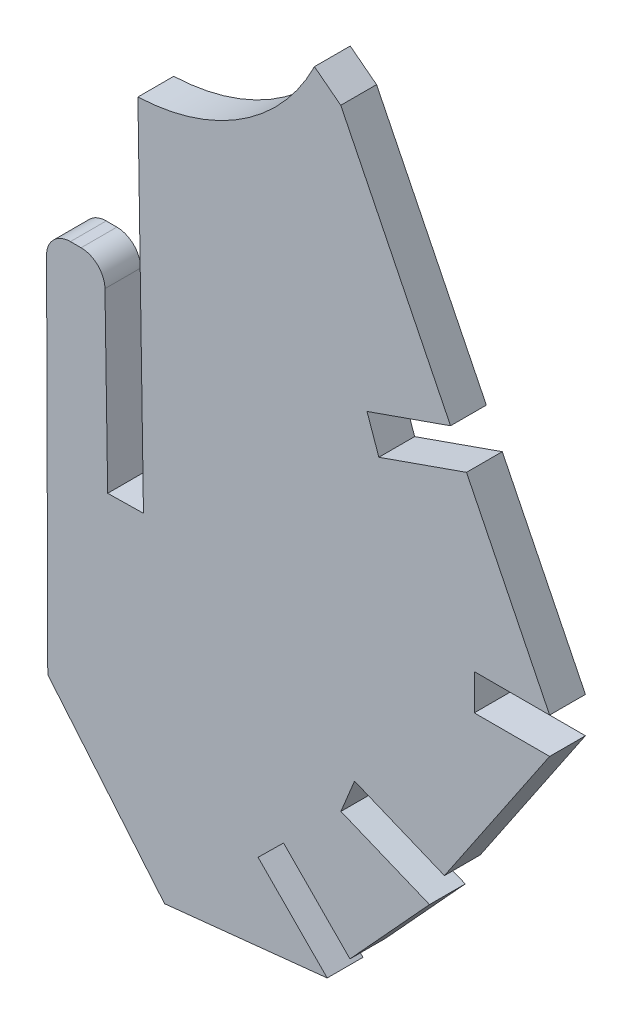
ISO-10303-21;
HEADER;
FILE_DESCRIPTION(('STEP AP214'),'2;1');
FILE_NAME('part.step','',(''),(''),'','','');
FILE_SCHEMA(('AUTOMOTIVE_DESIGN { 1 0 10303 214 1 1 1 1 }'));
ENDSEC;
DATA;
#1=APPLICATION_CONTEXT('core data for automotive mechanical design processes');
#2=APPLICATION_PROTOCOL_DEFINITION('international standard','automotive_design',2000,#1);
#3=PRODUCT_CONTEXT('',#1,'mechanical');
#4=PRODUCT('Part','Part','',(#3));
#5=PRODUCT_RELATED_PRODUCT_CATEGORY('part','',(#4));
#6=PRODUCT_DEFINITION_FORMATION('','',#4);
#7=PRODUCT_DEFINITION_CONTEXT('part definition',#1,'design');
#8=PRODUCT_DEFINITION('design','',#6,#7);
#9=PRODUCT_DEFINITION_SHAPE('','',#8);
#10=(LENGTH_UNIT() NAMED_UNIT(*) SI_UNIT(.MILLI.,.METRE.));
#11=(NAMED_UNIT(*) PLANE_ANGLE_UNIT() SI_UNIT($,.RADIAN.));
#12=(NAMED_UNIT(*) SI_UNIT($,.STERADIAN.) SOLID_ANGLE_UNIT());
#13=UNCERTAINTY_MEASURE_WITH_UNIT(LENGTH_MEASURE(1.E-05),#10,'distance_accuracy_value','');
#14=(GEOMETRIC_REPRESENTATION_CONTEXT(3) GLOBAL_UNCERTAINTY_ASSIGNED_CONTEXT((#13)) GLOBAL_UNIT_ASSIGNED_CONTEXT((#10,
#11,#12)) REPRESENTATION_CONTEXT('',''));
#15=CARTESIAN_POINT('',(0.,0.,0.));
#16=DIRECTION('',(0.,0.,1.));
#17=DIRECTION('',(1.,0.,0.));
#18=AXIS2_PLACEMENT_3D('',#15,#16,#17);
#19=CARTESIAN_POINT('',(1122.56231727025,109.439552642469,3.00000000000003));
#20=DIRECTION('',(0.,0.,-1.));
#21=DIRECTION('',(-1.,0.,0.));
#22=AXIS2_PLACEMENT_3D('',#19,#20,#21);
#23=CYLINDRICAL_SURFACE('',#22,17.2292656753027);
#24=CARTESIAN_POINT('',(1122.56231727025,109.439552642469,0.));
#25=DIRECTION('',(0.,0.,-1.));
#26=DIRECTION('',(1.,0.,0.));
#27=AXIS2_PLACEMENT_3D('',#24,#25,#26);
#28=CIRCLE('',#27,17.2292656753027);
#29=CARTESIAN_POINT('',(1138.01648220933,101.822704098241,2.0122792321331E-13));
#30=VERTEX_POINT('',#29);
#31=CARTESIAN_POINT('',(1123.21782403942,92.2227612286829,0.));
#32=VERTEX_POINT('',#31);
#33=EDGE_CURVE('E214',#30,#32,#28,.T.);
#34=ORIENTED_EDGE('',*,*,#33,.T.);
#35=DIRECTION('',(0.,0.,-1.));
#36=VECTOR('',#35,1.);
#37=CARTESIAN_POINT('',(1123.21782403942,92.222761228683,3.00000000000004));
#38=LINE('',#37,#36);
#39=CARTESIAN_POINT('',(1123.21782403942,92.222761228683,3.00000000000004));
#40=VERTEX_POINT('',#39);
#41=EDGE_CURVE('E11',#40,#32,#38,.T.);
#42=ORIENTED_EDGE('',*,*,#41,.F.);
#43=CARTESIAN_POINT('',(1122.56231727025,109.439552642469,3.00000000000003));
#44=DIRECTION('',(0.,0.,-1.));
#45=DIRECTION('',(1.,0.,0.));
#46=AXIS2_PLACEMENT_3D('',#43,#44,#45);
#47=CIRCLE('',#46,17.2292656753027);
#48=CARTESIAN_POINT('',(1138.01648220933,101.822704098241,3.00000000000021));
#49=VERTEX_POINT('',#48);
#50=EDGE_CURVE('E279',#49,#40,#47,.T.);
#51=ORIENTED_EDGE('',*,*,#50,.F.);
#52=DIRECTION('',(0.,0.,-1.));
#53=VECTOR('',#52,1.);
#54=CARTESIAN_POINT('',(1138.01648220933,101.822704098241,3.00000000000021));
#55=LINE('',#54,#53);
#56=EDGE_CURVE('E227',#49,#30,#55,.T.);
#57=ORIENTED_EDGE('',*,*,#56,.T.);
#58=EDGE_LOOP('',(#34,#42,#51,#57));
#59=FACE_BOUND('',#58,.T.);
#60=ADVANCED_FACE('F32',(#59),#23,.F.);
#61=CARTESIAN_POINT('',(1123.6820568135,62.2263533115428,3.00000000000001));
#62=DIRECTION('',(0.999880263904669,0.0154744258028453,0.));
#63=DIRECTION('',(-0.0154744258028454,0.999880263904671,0.));
#64=AXIS2_PLACEMENT_3D('',#61,#62,#63);
#65=PLANE('',#64);
#66=DIRECTION('',(0.0154744258028454,-0.999880263904671,0.));
#67=VECTOR('',#66,1.);
#68=CARTESIAN_POINT('',(1123.6820568135,62.2263533115428,0.));
#69=LINE('',#68,#67);
#70=CARTESIAN_POINT('',(1123.6820568135,62.2263533115428,0.));
#71=VERTEX_POINT('',#70);
#72=EDGE_CURVE('E210',#32,#71,#69,.T.);
#73=ORIENTED_EDGE('',*,*,#72,.T.);
#74=DIRECTION('',(0.,0.,-1.));
#75=VECTOR('',#74,1.);
#76=CARTESIAN_POINT('',(1123.6820568135,62.2263533115428,3.00000000000001));
#77=LINE('',#76,#75);
#78=CARTESIAN_POINT('',(1123.6820568135,62.2263533115428,3.00000000000001));
#79=VERTEX_POINT('',#78);
#80=EDGE_CURVE('E39',#79,#71,#77,.T.);
#81=ORIENTED_EDGE('',*,*,#80,.F.);
#82=DIRECTION('',(0.0154744258028454,-0.999880263904671,0.));
#83=VECTOR('',#82,1.);
#84=CARTESIAN_POINT('',(1123.6820568135,62.2263533115428,3.00000000000001));
#85=LINE('',#84,#83);
#86=EDGE_CURVE('E223',#40,#79,#85,.T.);
#87=ORIENTED_EDGE('',*,*,#86,.F.);
#88=ORIENTED_EDGE('',*,*,#41,.T.);
#89=EDGE_LOOP('',(#73,#81,#87,#88));
#90=FACE_BOUND('',#89,.T.);
#91=ADVANCED_FACE('F222',(#90),#65,.F.);
#92=CARTESIAN_POINT('',(1120.68241602179,62.1799300341342,3.00000000000025));
#93=DIRECTION('',(0.0154744258028453,-0.99988026390467,0.));
#94=DIRECTION('',(0.999880263904669,0.0154744258028453,0.));
#95=AXIS2_PLACEMENT_3D('',#92,#93,#94);
#96=PLANE('',#95);
#97=DIRECTION('',(-0.999880263904669,-0.0154744258028452,0.));
#98=VECTOR('',#97,1.);
#99=CARTESIAN_POINT('',(1120.68241602179,62.1799300341342,2.4980018054066E-13));
#100=LINE('',#99,#98);
#101=CARTESIAN_POINT('',(1120.68241602179,62.1799300341342,2.4980018054066E-13));
#102=VERTEX_POINT('',#101);
#103=EDGE_CURVE('E216',#71,#102,#100,.T.);
#104=ORIENTED_EDGE('',*,*,#103,.T.);
#105=DIRECTION('',(0.,0.,-1.));
#106=VECTOR('',#105,1.);
#107=CARTESIAN_POINT('',(1120.68241602179,62.1799300341342,3.00000000000025));
#108=LINE('',#107,#106);
#109=CARTESIAN_POINT('',(1120.68241602179,62.1799300341342,3.00000000000025));
#110=VERTEX_POINT('',#109);
#111=EDGE_CURVE('E400',#110,#102,#108,.T.);
#112=ORIENTED_EDGE('',*,*,#111,.F.);
#113=DIRECTION('',(-0.999880263904669,-0.0154744258028452,0.));
#114=VECTOR('',#113,1.);
#115=CARTESIAN_POINT('',(1120.68241602179,62.1799300341342,3.00000000000025));
#116=LINE('',#115,#114);
#117=EDGE_CURVE('E282',#79,#110,#116,.T.);
#118=ORIENTED_EDGE('',*,*,#117,.F.);
#119=ORIENTED_EDGE('',*,*,#80,.T.);
#120=EDGE_LOOP('',(#104,#112,#118,#119));
#121=FACE_BOUND('',#120,.T.);
#122=ADVANCED_FACE('F404',(#121),#96,.F.);
#123=CARTESIAN_POINT('',(1120.68241602179,62.1799300341342,3.00000000000025));
#124=DIRECTION('',(-0.999880263904737,-0.0154744257984556,0.));
#125=DIRECTION('',(0.0154744257984557,-0.999880263904739,0.));
#126=AXIS2_PLACEMENT_3D('',#123,#124,#125);
#127=PLANE('',#126);
#128=DIRECTION('',(-0.0154744257984556,0.999880263904739,0.));
#129=VECTOR('',#128,1.);
#130=CARTESIAN_POINT('',(1120.68241602179,62.1799300341342,2.4980018054066E-13));
#131=LINE('',#130,#129);
#132=CARTESIAN_POINT('',(1120.45422071051,76.924773625341,0.));
#133=VERTEX_POINT('',#132);
#134=EDGE_CURVE('E231',#102,#133,#131,.T.);
#135=ORIENTED_EDGE('',*,*,#134,.T.);
#136=DIRECTION('',(0.,0.,-1.));
#137=VECTOR('',#136,1.);
#138=CARTESIAN_POINT('',(1120.45422071051,76.9247736253409,3.00000000000013));
#139=LINE('',#138,#137);
#140=CARTESIAN_POINT('',(1120.45422071051,76.9247736253409,3.00000000000013));
#141=VERTEX_POINT('',#140);
#142=EDGE_CURVE('E397',#141,#133,#139,.T.);
#143=ORIENTED_EDGE('',*,*,#142,.F.);
#144=DIRECTION('',(-0.0154744257984556,0.999880263904739,0.));
#145=VECTOR('',#144,1.);
#146=CARTESIAN_POINT('',(1120.68241602179,62.1799300341342,3.00000000000025));
#147=LINE('',#146,#145);
#148=EDGE_CURVE('E284',#110,#141,#147,.T.);
#149=ORIENTED_EDGE('',*,*,#148,.F.);
#150=ORIENTED_EDGE('',*,*,#111,.T.);
#151=EDGE_LOOP('',(#135,#143,#149,#150));
#152=FACE_BOUND('',#151,.T.);
#153=ADVANCED_FACE('F412',(#152),#127,.F.);
#154=CARTESIAN_POINT('',(1118.4544601827,76.8938247737439,3.0000000000002));
#155=DIRECTION('',(0.,0.,-1.));
#156=DIRECTION('',(-1.,0.,0.));
#157=AXIS2_PLACEMENT_3D('',#154,#155,#156);
#158=CYLINDRICAL_SURFACE('',#157,1.9999999999975);
#159=CARTESIAN_POINT('',(1118.4544601827,76.893824773744,0.));
#160=DIRECTION('',(0.,0.,1.));
#161=DIRECTION('',(1.,0.,0.));
#162=AXIS2_PLACEMENT_3D('',#159,#160,#161);
#163=CIRCLE('',#162,1.9999999999975);
#164=CARTESIAN_POINT('',(1118.4544601827,78.8938247737414,1.6306400674182E-13));
#165=VERTEX_POINT('',#164);
#166=EDGE_CURVE('E233',#133,#165,#163,.T.);
#167=ORIENTED_EDGE('',*,*,#166,.T.);
#168=DIRECTION('',(0.,0.,-1.));
#169=VECTOR('',#168,1.);
#170=CARTESIAN_POINT('',(1118.4544601827,78.8938247737414,3.00000000000011));
#171=LINE('',#170,#169);
#172=CARTESIAN_POINT('',(1118.4544601827,78.8938247737414,3.00000000000011));
#173=VERTEX_POINT('',#172);
#174=EDGE_CURVE('E394',#173,#165,#171,.T.);
#175=ORIENTED_EDGE('',*,*,#174,.F.);
#176=CARTESIAN_POINT('',(1118.4544601827,76.8938247737439,3.0000000000002));
#177=DIRECTION('',(0.,0.,1.));
#178=DIRECTION('',(1.,0.,0.));
#179=AXIS2_PLACEMENT_3D('',#176,#177,#178);
#180=CIRCLE('',#179,1.9999999999975);
#181=EDGE_CURVE('E286',#141,#173,#180,.T.);
#182=ORIENTED_EDGE('',*,*,#181,.F.);
#183=ORIENTED_EDGE('',*,*,#142,.T.);
#184=EDGE_LOOP('',(#167,#175,#182,#183));
#185=FACE_BOUND('',#184,.T.);
#186=ADVANCED_FACE('F415',(#185),#158,.T.);
#187=CARTESIAN_POINT('',(1118.4544601827,78.8938247737413,3.00000000000013));
#188=DIRECTION('',(0.,-1.,0.));
#189=DIRECTION('',(1.,0.,0.));
#190=AXIS2_PLACEMENT_3D('',#187,#188,#189);
#191=PLANE('',#190);
#192=DIRECTION('',(-1.,0.,0.));
#193=VECTOR('',#192,1.);
#194=CARTESIAN_POINT('',(1118.4544601827,78.8938247737413,1.43982048506075E-13));
#195=LINE('',#194,#193);
#196=CARTESIAN_POINT('',(1117.55919909577,78.8938247737414,1.76941794549634E-13));
#197=VERTEX_POINT('',#196);
#198=EDGE_CURVE('E235',#165,#197,#195,.T.);
#199=ORIENTED_EDGE('',*,*,#198,.T.);
#200=DIRECTION('',(0.,0.,-1.));
#201=VECTOR('',#200,1.);
#202=CARTESIAN_POINT('',(1117.55919909577,78.8938247737414,3.00000000000018));
#203=LINE('',#202,#201);
#204=CARTESIAN_POINT('',(1117.55919909577,78.8938247737414,3.00000000000018));
#205=VERTEX_POINT('',#204);
#206=EDGE_CURVE('E391',#205,#197,#203,.T.);
#207=ORIENTED_EDGE('',*,*,#206,.F.);
#208=DIRECTION('',(-1.,0.,0.));
#209=VECTOR('',#208,1.);
#210=CARTESIAN_POINT('',(1118.4544601827,78.8938247737413,3.00000000000013));
#211=LINE('',#210,#209);
#212=EDGE_CURVE('E288',#173,#205,#211,.T.);
#213=ORIENTED_EDGE('',*,*,#212,.F.);
#214=ORIENTED_EDGE('',*,*,#174,.T.);
#215=EDGE_LOOP('',(#199,#207,#213,#214));
#216=FACE_BOUND('',#215,.T.);
#217=ADVANCED_FACE('F420',(#216),#191,.F.);
#218=CARTESIAN_POINT('',(1117.55919909577,76.8938247737439,3.00000000000022));
#219=DIRECTION('',(0.,0.,-1.));
#220=DIRECTION('',(-1.,0.,0.));
#221=AXIS2_PLACEMENT_3D('',#218,#219,#220);
#222=CYLINDRICAL_SURFACE('',#221,1.99999999999705);
#223=CARTESIAN_POINT('',(1117.55919909577,76.893824773744,0.));
#224=DIRECTION('',(0.,0.,1.));
#225=DIRECTION('',(-1.,0.,0.));
#226=AXIS2_PLACEMENT_3D('',#223,#224,#225);
#227=CIRCLE('',#226,1.99999999999705);
#228=CARTESIAN_POINT('',(1115.55921001566,76.8872157318644,1.49186218934005E-13));
#229=VERTEX_POINT('',#228);
#230=EDGE_CURVE('E237',#197,#229,#227,.T.);
#231=ORIENTED_EDGE('',*,*,#230,.T.);
#232=DIRECTION('',(0.,0.,-1.));
#233=VECTOR('',#232,1.);
#234=CARTESIAN_POINT('',(1115.55921001566,76.8872157318644,3.00000000000016));
#235=LINE('',#234,#233);
#236=CARTESIAN_POINT('',(1115.55921001566,76.8872157318644,3.00000000000016));
#237=VERTEX_POINT('',#236);
#238=EDGE_CURVE('E388',#237,#229,#235,.T.);
#239=ORIENTED_EDGE('',*,*,#238,.F.);
#240=CARTESIAN_POINT('',(1117.55919909577,76.8938247737439,3.00000000000022));
#241=DIRECTION('',(0.,0.,1.));
#242=DIRECTION('',(-1.,0.,0.));
#243=AXIS2_PLACEMENT_3D('',#240,#241,#242);
#244=CIRCLE('',#243,1.99999999999705);
#245=EDGE_CURVE('E290',#205,#237,#244,.T.);
#246=ORIENTED_EDGE('',*,*,#245,.F.);
#247=ORIENTED_EDGE('',*,*,#206,.T.);
#248=EDGE_LOOP('',(#231,#239,#246,#247));
#249=FACE_BOUND('',#248,.T.);
#250=ADVANCED_FACE('F426',(#249),#222,.T.);
#251=CARTESIAN_POINT('',(1115.65962808626,46.4992944116065,3.00000000000013));
#252=DIRECTION('',(0.999994540055773,0.00330452093979811,0.));
#253=DIRECTION('',(-0.00330452093979833,0.999994540055775,0.));
#254=AXIS2_PLACEMENT_3D('',#251,#252,#253);
#255=PLANE('',#254);
#256=DIRECTION('',(0.00330452093979833,-0.999994540055774,0.));
#257=VECTOR('',#256,1.);
#258=CARTESIAN_POINT('',(1115.65962808626,46.4992944116065,1.75207071073658E-13));
#259=LINE('',#258,#257);
#260=CARTESIAN_POINT('',(1115.65962808626,46.4992944116065,1.75207071073658E-13));
#261=VERTEX_POINT('',#260);
#262=EDGE_CURVE('E239',#229,#261,#259,.T.);
#263=ORIENTED_EDGE('',*,*,#262,.T.);
#264=DIRECTION('',(0.,0.,-1.));
#265=VECTOR('',#264,1.);
#266=CARTESIAN_POINT('',(1115.65962808626,46.4992944116065,3.00000000000013));
#267=LINE('',#266,#265);
#268=CARTESIAN_POINT('',(1115.65962808626,46.4992944116065,3.00000000000013));
#269=VERTEX_POINT('',#268);
#270=EDGE_CURVE('E385',#269,#261,#267,.T.);
#271=ORIENTED_EDGE('',*,*,#270,.F.);
#272=DIRECTION('',(0.00330452093979833,-0.999994540055774,0.));
#273=VECTOR('',#272,1.);
#274=CARTESIAN_POINT('',(1115.65962808626,46.4992944116065,3.00000000000013));
#275=LINE('',#274,#273);
#276=EDGE_CURVE('E292',#237,#269,#275,.T.);
#277=ORIENTED_EDGE('',*,*,#276,.F.);
#278=ORIENTED_EDGE('',*,*,#238,.T.);
#279=EDGE_LOOP('',(#263,#271,#277,#278));
#280=FACE_BOUND('',#279,.T.);
#281=ADVANCED_FACE('F430',(#280),#255,.F.);
#282=CARTESIAN_POINT('',(1115.65962808626,46.4992944116065,3.00000000000013));
#283=DIRECTION('',(0.767716329482746,0.640789854355966,0.));
#284=DIRECTION('',(-0.640789854355966,0.767716329482747,0.));
#285=AXIS2_PLACEMENT_3D('',#282,#283,#284);
#286=PLANE('',#285);
#287=DIRECTION('',(0.640789854355966,-0.767716329482746,0.));
#288=VECTOR('',#287,1.);
#289=CARTESIAN_POINT('',(1115.65962808626,46.4992944116065,1.75207071073658E-13));
#290=LINE('',#289,#288);
#291=CARTESIAN_POINT('',(1125.45256416186,34.7665915797698,1.94289029309402E-13));
#292=VERTEX_POINT('',#291);
#293=EDGE_CURVE('E241',#261,#292,#290,.T.);
#294=ORIENTED_EDGE('',*,*,#293,.T.);
#295=DIRECTION('',(0.,0.,-1.));
#296=VECTOR('',#295,1.);
#297=CARTESIAN_POINT('',(1125.45256416186,34.7665915797698,3.00000000000018));
#298=LINE('',#297,#296);
#299=CARTESIAN_POINT('',(1125.45256416186,34.7665915797698,3.00000000000018));
#300=VERTEX_POINT('',#299);
#301=EDGE_CURVE('E382',#300,#292,#298,.T.);
#302=ORIENTED_EDGE('',*,*,#301,.F.);
#303=DIRECTION('',(0.640789854355966,-0.767716329482746,0.));
#304=VECTOR('',#303,1.);
#305=CARTESIAN_POINT('',(1115.65962808626,46.4992944116065,3.00000000000013));
#306=LINE('',#305,#304);
#307=EDGE_CURVE('E294',#269,#300,#306,.T.);
#308=ORIENTED_EDGE('',*,*,#307,.F.);
#309=ORIENTED_EDGE('',*,*,#270,.T.);
#310=EDGE_LOOP('',(#294,#302,#308,#309));
#311=FACE_BOUND('',#310,.T.);
#312=ADVANCED_FACE('F435',(#311),#286,.F.);
#313=CARTESIAN_POINT('',(1139.08679164529,36.1904710032458,2.99999999999999));
#314=DIRECTION('',(-0.103869295022175,0.994590955896744,0.));
#315=DIRECTION('',(-0.994590955896742,-0.103869295022175,0.));
#316=AXIS2_PLACEMENT_3D('',#313,#314,#315);
#317=PLANE('',#316);
#318=DIRECTION('',(0.994590955896742,0.103869295022175,0.));
#319=VECTOR('',#318,1.);
#320=CARTESIAN_POINT('',(1139.08679164529,36.1904710032457,0.));
#321=LINE('',#320,#319);
#322=CARTESIAN_POINT('',(1139.08679164529,36.1904710032457,0.));
#323=VERTEX_POINT('',#322);
#324=EDGE_CURVE('E243',#292,#323,#321,.T.);
#325=ORIENTED_EDGE('',*,*,#324,.T.);
#326=DIRECTION('',(0.,0.,-1.));
#327=VECTOR('',#326,1.);
#328=CARTESIAN_POINT('',(1139.08679164529,36.1904710032458,2.99999999999999));
#329=LINE('',#328,#327);
#330=CARTESIAN_POINT('',(1139.08679164529,36.1904710032458,2.99999999999999));
#331=VERTEX_POINT('',#330);
#332=EDGE_CURVE('E379',#331,#323,#329,.T.);
#333=ORIENTED_EDGE('',*,*,#332,.F.);
#334=DIRECTION('',(0.994590955896742,0.103869295022175,0.));
#335=VECTOR('',#334,1.);
#336=CARTESIAN_POINT('',(1139.08679164529,36.1904710032458,2.99999999999999));
#337=LINE('',#336,#335);
#338=EDGE_CURVE('E296',#300,#331,#337,.T.);
#339=ORIENTED_EDGE('',*,*,#338,.F.);
#340=ORIENTED_EDGE('',*,*,#301,.T.);
#341=EDGE_LOOP('',(#325,#333,#339,#340));
#342=FACE_BOUND('',#341,.T.);
#343=ADVANCED_FACE('F441',(#342),#317,.F.);
#344=CARTESIAN_POINT('',(1139.08679164529,36.1904710032458,2.99999999999999));
#345=DIRECTION('',(-0.711402667900407,-0.702784635648919,0.));
#346=DIRECTION('',(0.702784635648918,-0.711402667900408,0.));
#347=AXIS2_PLACEMENT_3D('',#344,#345,#346);
#348=PLANE('',#347);
#349=DIRECTION('',(-0.702784635648918,0.711402667900408,0.));
#350=VECTOR('',#349,1.);
#351=CARTESIAN_POINT('',(1139.08679164529,36.1904710032457,0.));
#352=LINE('',#351,#350);
#353=CARTESIAN_POINT('',(1133.29208512372,42.0562362320768,2.65412691824451E-13));
#354=VERTEX_POINT('',#353);
#355=EDGE_CURVE('E245',#323,#354,#352,.T.);
#356=ORIENTED_EDGE('',*,*,#355,.T.);
#357=DIRECTION('',(0.,0.,-1.));
#358=VECTOR('',#357,1.);
#359=CARTESIAN_POINT('',(1133.29208512372,42.0562362320768,3.0000000000003));
#360=LINE('',#359,#358);
#361=CARTESIAN_POINT('',(1133.29208512372,42.0562362320768,3.0000000000003));
#362=VERTEX_POINT('',#361);
#363=EDGE_CURVE('E376',#362,#354,#360,.T.);
#364=ORIENTED_EDGE('',*,*,#363,.F.);
#365=DIRECTION('',(-0.702784635648918,0.711402667900408,0.));
#366=VECTOR('',#365,1.);
#367=CARTESIAN_POINT('',(1139.08679164529,36.1904710032458,2.99999999999999));
#368=LINE('',#367,#366);
#369=EDGE_CURVE('E298',#331,#362,#368,.T.);
#370=ORIENTED_EDGE('',*,*,#369,.F.);
#371=ORIENTED_EDGE('',*,*,#332,.T.);
#372=EDGE_LOOP('',(#356,#364,#370,#371));
#373=FACE_BOUND('',#372,.T.);
#374=ADVANCED_FACE('F445',(#373),#348,.F.);
#375=CARTESIAN_POINT('',(1133.29208512372,42.0562362320768,3.0000000000003));
#376=DIRECTION('',(-0.702784635648948,0.711402667900378,0.));
#377=DIRECTION('',(-0.711402667900377,-0.702784635648949,0.));
#378=AXIS2_PLACEMENT_3D('',#375,#376,#377);
#379=PLANE('',#378);
#380=DIRECTION('',(0.711402667900377,0.702784635648949,0.));
#381=VECTOR('',#380,1.);
#382=CARTESIAN_POINT('',(1133.29208512372,42.0562362320768,2.65412691824451E-13));
#383=LINE('',#382,#381);
#384=CARTESIAN_POINT('',(1135.42629312742,44.1645901390235,2.22044604925031E-13));
#385=VERTEX_POINT('',#384);
#386=EDGE_CURVE('E247',#354,#385,#383,.T.);
#387=ORIENTED_EDGE('',*,*,#386,.T.);
#388=DIRECTION('',(0.,0.,-1.));
#389=VECTOR('',#388,1.);
#390=CARTESIAN_POINT('',(1135.42629312742,44.1645901390235,3.00000000000022));
#391=LINE('',#390,#389);
#392=CARTESIAN_POINT('',(1135.42629312742,44.1645901390235,3.00000000000022));
#393=VERTEX_POINT('',#392);
#394=EDGE_CURVE('E373',#393,#385,#391,.T.);
#395=ORIENTED_EDGE('',*,*,#394,.F.);
#396=DIRECTION('',(0.711402667900377,0.702784635648949,0.));
#397=VECTOR('',#396,1.);
#398=CARTESIAN_POINT('',(1133.29208512372,42.0562362320768,3.0000000000003));
#399=LINE('',#398,#397);
#400=EDGE_CURVE('E300',#362,#393,#399,.T.);
#401=ORIENTED_EDGE('',*,*,#400,.F.);
#402=ORIENTED_EDGE('',*,*,#363,.T.);
#403=EDGE_LOOP('',(#387,#395,#401,#402));
#404=FACE_BOUND('',#403,.T.);
#405=ADVANCED_FACE('F450',(#404),#379,.F.);
#406=CARTESIAN_POINT('',(1135.42629312742,44.1645901390235,3.00000000000022));
#407=DIRECTION('',(0.711402667900377,0.702784635648949,0.));
#408=DIRECTION('',(-0.702784635648948,0.711402667900378,0.));
#409=AXIS2_PLACEMENT_3D('',#406,#407,#408);
#410=PLANE('',#409);
#411=DIRECTION('',(0.702784635648948,-0.711402667900378,0.));
#412=VECTOR('',#411,1.);
#413=CARTESIAN_POINT('',(1135.42629312742,44.1645901390235,2.22044604925031E-13));
#414=LINE('',#413,#412);
#415=CARTESIAN_POINT('',(1140.99300711838,38.5296132432231,1.6306400674182E-13));
#416=VERTEX_POINT('',#415);
#417=EDGE_CURVE('E249',#385,#416,#414,.T.);
#418=ORIENTED_EDGE('',*,*,#417,.T.);
#419=DIRECTION('',(0.,0.,-1.));
#420=VECTOR('',#419,1.);
#421=CARTESIAN_POINT('',(1140.99300711838,38.5296132432231,3.00000000000012));
#422=LINE('',#421,#420);
#423=CARTESIAN_POINT('',(1140.99300711838,38.5296132432231,3.00000000000012));
#424=VERTEX_POINT('',#423);
#425=EDGE_CURVE('E370',#424,#416,#422,.T.);
#426=ORIENTED_EDGE('',*,*,#425,.F.);
#427=DIRECTION('',(0.702784635648948,-0.711402667900378,0.));
#428=VECTOR('',#427,1.);
#429=CARTESIAN_POINT('',(1135.42629312742,44.1645901390235,3.00000000000022));
#430=LINE('',#429,#428);
#431=EDGE_CURVE('E302',#393,#424,#430,.T.);
#432=ORIENTED_EDGE('',*,*,#431,.F.);
#433=ORIENTED_EDGE('',*,*,#394,.T.);
#434=EDGE_LOOP('',(#418,#426,#432,#433));
#435=FACE_BOUND('',#434,.T.);
#436=ADVANCED_FACE('F456',(#435),#410,.F.);
#437=CARTESIAN_POINT('',(1147.66183984331,45.8092952941066,3.00000000000008));
#438=DIRECTION('',(-0.737366474180643,0.675492918359925,0.));
#439=DIRECTION('',(-0.675492918359924,-0.737366474180644,0.));
#440=AXIS2_PLACEMENT_3D('',#437,#438,#439);
#441=PLANE('',#440);
#442=DIRECTION('',(0.675492918359924,0.737366474180644,0.));
#443=VECTOR('',#442,1.);
#444=CARTESIAN_POINT('',(1147.66183984331,45.8092952941066,1.90819582357449E-13));
#445=LINE('',#444,#443);
#446=CARTESIAN_POINT('',(1147.66183984331,45.8092952941066,1.90819582357449E-13));
#447=VERTEX_POINT('',#446);
#448=EDGE_CURVE('E251',#416,#447,#445,.T.);
#449=ORIENTED_EDGE('',*,*,#448,.T.);
#450=DIRECTION('',(0.,0.,-1.));
#451=VECTOR('',#450,1.);
#452=CARTESIAN_POINT('',(1147.66183984331,45.8092952941066,3.00000000000008));
#453=LINE('',#452,#451);
#454=CARTESIAN_POINT('',(1147.66183984331,45.8092952941066,3.00000000000008));
#455=VERTEX_POINT('',#454);
#456=EDGE_CURVE('E367',#455,#447,#453,.T.);
#457=ORIENTED_EDGE('',*,*,#456,.F.);
#458=DIRECTION('',(0.675492918359924,0.737366474180644,0.));
#459=VECTOR('',#458,1.);
#460=CARTESIAN_POINT('',(1147.66183984331,45.8092952941066,3.00000000000008));
#461=LINE('',#460,#459);
#462=EDGE_CURVE('E304',#424,#455,#461,.T.);
#463=ORIENTED_EDGE('',*,*,#462,.F.);
#464=ORIENTED_EDGE('',*,*,#425,.T.);
#465=EDGE_LOOP('',(#449,#457,#463,#464));
#466=FACE_BOUND('',#465,.T.);
#467=ADVANCED_FACE('F460',(#466),#441,.F.);
#468=CARTESIAN_POINT('',(1147.66183984331,45.8092952941066,3.00000000000008));
#469=DIRECTION('',(-0.379943593200066,-0.925009657239439,0.));
#470=DIRECTION('',(0.925009657239438,-0.379943593200066,0.));
#471=AXIS2_PLACEMENT_3D('',#468,#469,#470);
#472=PLANE('',#471);
#473=DIRECTION('',(-0.925009657239438,0.379943593200066,0.));
#474=VECTOR('',#473,1.);
#475=CARTESIAN_POINT('',(1147.66183984331,45.8092952941066,1.90819582357449E-13));
#476=LINE('',#475,#474);
#477=CARTESIAN_POINT('',(1140.23706137265,48.8589899527288,3.45209971719385E-13));
#478=VERTEX_POINT('',#477);
#479=EDGE_CURVE('E253',#447,#478,#476,.T.);
#480=ORIENTED_EDGE('',*,*,#479,.T.);
#481=DIRECTION('',(0.,0.,-1.));
#482=VECTOR('',#481,1.);
#483=CARTESIAN_POINT('',(1140.23706137265,48.8589899527288,3.00000000000033));
#484=LINE('',#483,#482);
#485=CARTESIAN_POINT('',(1140.23706137265,48.8589899527288,3.00000000000033));
#486=VERTEX_POINT('',#485);
#487=EDGE_CURVE('E364',#486,#478,#484,.T.);
#488=ORIENTED_EDGE('',*,*,#487,.F.);
#489=DIRECTION('',(-0.925009657239438,0.379943593200066,0.));
#490=VECTOR('',#489,1.);
#491=CARTESIAN_POINT('',(1147.66183984331,45.8092952941066,3.00000000000008));
#492=LINE('',#491,#490);
#493=EDGE_CURVE('E306',#455,#486,#492,.T.);
#494=ORIENTED_EDGE('',*,*,#493,.F.);
#495=ORIENTED_EDGE('',*,*,#456,.T.);
#496=EDGE_LOOP('',(#480,#488,#494,#495));
#497=FACE_BOUND('',#496,.T.);
#498=ADVANCED_FACE('F465',(#497),#472,.F.);
#499=CARTESIAN_POINT('',(1140.23706137265,48.8589899527288,3.00000000000033));
#500=DIRECTION('',(-0.925009657238977,0.379943593201189,0.));
#501=DIRECTION('',(-0.379943593201189,-0.925009657238978,0.));
#502=AXIS2_PLACEMENT_3D('',#499,#500,#501);
#503=PLANE('',#502);
#504=DIRECTION('',(0.379943593201189,0.925009657238978,0.));
#505=VECTOR('',#504,1.);
#506=CARTESIAN_POINT('',(1140.23706137265,48.8589899527288,3.45209971719385E-13));
#507=LINE('',#506,#505);
#508=CARTESIAN_POINT('',(1141.37689215225,51.6340189244458,1.49186218934005E-13));
#509=VERTEX_POINT('',#508);
#510=EDGE_CURVE('E255',#478,#509,#507,.T.);
#511=ORIENTED_EDGE('',*,*,#510,.T.);
#512=DIRECTION('',(0.,0.,-1.));
#513=VECTOR('',#512,1.);
#514=CARTESIAN_POINT('',(1141.37689215225,51.6340189244457,3.0000000000001));
#515=LINE('',#514,#513);
#516=CARTESIAN_POINT('',(1141.37689215225,51.6340189244457,3.0000000000001));
#517=VERTEX_POINT('',#516);
#518=EDGE_CURVE('E361',#517,#509,#515,.T.);
#519=ORIENTED_EDGE('',*,*,#518,.F.);
#520=DIRECTION('',(0.379943593201189,0.925009657238978,0.));
#521=VECTOR('',#520,1.);
#522=CARTESIAN_POINT('',(1140.23706137265,48.8589899527288,3.00000000000033));
#523=LINE('',#522,#521);
#524=EDGE_CURVE('E308',#486,#517,#523,.T.);
#525=ORIENTED_EDGE('',*,*,#524,.F.);
#526=ORIENTED_EDGE('',*,*,#487,.T.);
#527=EDGE_LOOP('',(#511,#519,#525,#526));
#528=FACE_BOUND('',#527,.T.);
#529=ADVANCED_FACE('F471',(#528),#503,.F.);
#530=CARTESIAN_POINT('',(1141.37689215225,51.6340189244457,3.0000000000001));
#531=DIRECTION('',(0.379943593201203,0.925009657238972,0.));
#532=DIRECTION('',(-0.925009657238971,0.379943593201204,0.));
#533=AXIS2_PLACEMENT_3D('',#530,#531,#532);
#534=PLANE('',#533);
#535=DIRECTION('',(0.925009657238971,-0.379943593201204,0.));
#536=VECTOR('',#535,1.);
#537=CARTESIAN_POINT('',(1141.37689215225,51.6340189244458,1.49186218934005E-13));
#538=LINE('',#537,#536);
#539=CARTESIAN_POINT('',(1148.91475218066,48.5378765200637,0.));
#540=VERTEX_POINT('',#539);
#541=EDGE_CURVE('E257',#509,#540,#538,.T.);
#542=ORIENTED_EDGE('',*,*,#541,.T.);
#543=DIRECTION('',(0.,0.,-1.));
#544=VECTOR('',#543,1.);
#545=CARTESIAN_POINT('',(1148.91475218066,48.5378765200637,3.0000000000002));
#546=LINE('',#545,#544);
#547=CARTESIAN_POINT('',(1148.91475218066,48.5378765200637,3.0000000000002));
#548=VERTEX_POINT('',#547);
#549=EDGE_CURVE('E358',#548,#540,#546,.T.);
#550=ORIENTED_EDGE('',*,*,#549,.F.);
#551=DIRECTION('',(0.925009657238971,-0.379943593201204,0.));
#552=VECTOR('',#551,1.);
#553=CARTESIAN_POINT('',(1141.37689215225,51.6340189244457,3.0000000000001));
#554=LINE('',#553,#552);
#555=EDGE_CURVE('E310',#517,#548,#554,.T.);
#556=ORIENTED_EDGE('',*,*,#555,.F.);
#557=ORIENTED_EDGE('',*,*,#518,.T.);
#558=EDGE_LOOP('',(#542,#550,#556,#557));
#559=FACE_BOUND('',#558,.T.);
#560=ADVANCED_FACE('F475',(#559),#534,.F.);
#561=CARTESIAN_POINT('',(1157.73511185254,61.6037081564896,3.00000000000021));
#562=DIRECTION('',(-0.828821513134687,0.559513091325956,0.));
#563=DIRECTION('',(-0.559513091325956,-0.828821513134688,0.));
#564=AXIS2_PLACEMENT_3D('',#561,#562,#563);
#565=PLANE('',#564);
#566=DIRECTION('',(0.559513091325955,0.828821513134688,0.));
#567=VECTOR('',#566,1.);
#568=CARTESIAN_POINT('',(1157.73511185254,61.6037081564895,2.28983498828939E-13));
#569=LINE('',#568,#567);
#570=CARTESIAN_POINT('',(1157.73511185254,61.6037081564895,2.28983498828939E-13));
#571=VERTEX_POINT('',#570);
#572=EDGE_CURVE('E259',#540,#571,#569,.T.);
#573=ORIENTED_EDGE('',*,*,#572,.T.);
#574=DIRECTION('',(0.,0.,-1.));
#575=VECTOR('',#574,1.);
#576=CARTESIAN_POINT('',(1157.73511185254,61.6037081564896,3.00000000000021));
#577=LINE('',#576,#575);
#578=CARTESIAN_POINT('',(1157.73511185254,61.6037081564896,3.00000000000021));
#579=VERTEX_POINT('',#578);
#580=EDGE_CURVE('E355',#579,#571,#577,.T.);
#581=ORIENTED_EDGE('',*,*,#580,.F.);
#582=DIRECTION('',(0.559513091325955,0.828821513134688,0.));
#583=VECTOR('',#582,1.);
#584=CARTESIAN_POINT('',(1157.73511185254,61.6037081564896,3.00000000000021));
#585=LINE('',#584,#583);
#586=EDGE_CURVE('E312',#548,#579,#585,.T.);
#587=ORIENTED_EDGE('',*,*,#586,.F.);
#588=ORIENTED_EDGE('',*,*,#549,.T.);
#589=EDGE_LOOP('',(#573,#581,#587,#588));
#590=FACE_BOUND('',#589,.T.);
#591=ADVANCED_FACE('F480',(#590),#565,.F.);
#592=CARTESIAN_POINT('',(1157.73511185254,61.6037081564896,3.00000000000021));
#593=DIRECTION('',(0.,-1.,0.));
#594=DIRECTION('',(1.,0.,0.));
#595=AXIS2_PLACEMENT_3D('',#592,#593,#594);
#596=PLANE('',#595);
#597=DIRECTION('',(-1.,0.,0.));
#598=VECTOR('',#597,1.);
#599=CARTESIAN_POINT('',(1157.73511185254,61.6037081564895,2.28983498828939E-13));
#600=LINE('',#599,#598);
#601=CARTESIAN_POINT('',(1151.41486056954,61.6037081564896,2.18575157973078E-13));
#602=VERTEX_POINT('',#601);
#603=EDGE_CURVE('E261',#571,#602,#600,.T.);
#604=ORIENTED_EDGE('',*,*,#603,.T.);
#605=DIRECTION('',(0.,0.,-1.));
#606=VECTOR('',#605,1.);
#607=CARTESIAN_POINT('',(1151.41486056954,61.6037081564896,3.00000000000022));
#608=LINE('',#607,#606);
#609=CARTESIAN_POINT('',(1151.41486056954,61.6037081564896,3.00000000000022));
#610=VERTEX_POINT('',#609);
#611=EDGE_CURVE('E352',#610,#602,#608,.T.);
#612=ORIENTED_EDGE('',*,*,#611,.F.);
#613=DIRECTION('',(-1.,0.,0.));
#614=VECTOR('',#613,1.);
#615=CARTESIAN_POINT('',(1157.73511185254,61.6037081564896,3.00000000000021));
#616=LINE('',#615,#614);
#617=EDGE_CURVE('E314',#579,#610,#616,.T.);
#618=ORIENTED_EDGE('',*,*,#617,.F.);
#619=ORIENTED_EDGE('',*,*,#580,.T.);
#620=EDGE_LOOP('',(#604,#612,#618,#619));
#621=FACE_BOUND('',#620,.T.);
#622=ADVANCED_FACE('F486',(#621),#596,.F.);
#623=CARTESIAN_POINT('',(1151.41486056954,61.6037081564896,3.00000000000022));
#624=DIRECTION('',(-1.,0.,0.));
#625=DIRECTION('',(0.,-1.,0.));
#626=AXIS2_PLACEMENT_3D('',#623,#624,#625);
#627=PLANE('',#626);
#628=DIRECTION('',(0.,1.,0.));
#629=VECTOR('',#628,1.);
#630=CARTESIAN_POINT('',(1151.41486056954,61.6037081564896,2.18575157973078E-13));
#631=LINE('',#630,#629);
#632=CARTESIAN_POINT('',(1151.41486056954,64.6037081564895,1.85615411929518E-13));
#633=VERTEX_POINT('',#632);
#634=EDGE_CURVE('E263',#602,#633,#631,.T.);
#635=ORIENTED_EDGE('',*,*,#634,.T.);
#636=DIRECTION('',(0.,0.,-1.));
#637=VECTOR('',#636,1.);
#638=CARTESIAN_POINT('',(1151.41486056954,64.6037081564895,3.00000000000019));
#639=LINE('',#638,#637);
#640=CARTESIAN_POINT('',(1151.41486056954,64.6037081564895,3.00000000000019));
#641=VERTEX_POINT('',#640);
#642=EDGE_CURVE('E349',#641,#633,#639,.T.);
#643=ORIENTED_EDGE('',*,*,#642,.F.);
#644=DIRECTION('',(0.,1.,0.));
#645=VECTOR('',#644,1.);
#646=CARTESIAN_POINT('',(1151.41486056954,61.6037081564896,3.00000000000022));
#647=LINE('',#646,#645);
#648=EDGE_CURVE('E316',#610,#641,#647,.T.);
#649=ORIENTED_EDGE('',*,*,#648,.F.);
#650=ORIENTED_EDGE('',*,*,#611,.T.);
#651=EDGE_LOOP('',(#635,#643,#649,#650));
#652=FACE_BOUND('',#651,.T.);
#653=ADVANCED_FACE('F490',(#652),#627,.F.);
#654=CARTESIAN_POINT('',(1151.41486056954,64.6037081564895,3.00000000000019));
#655=DIRECTION('',(-2.19546603119625E-13,1.,0.));
#656=DIRECTION('',(-1.,-2.19546603119625E-13,0.));
#657=AXIS2_PLACEMENT_3D('',#654,#655,#656);
#658=PLANE('',#657);
#659=DIRECTION('',(1.,2.19546603119625E-13,0.));
#660=VECTOR('',#659,1.);
#661=CARTESIAN_POINT('',(1151.41486056954,64.6037081564895,1.85615411929518E-13));
#662=LINE('',#661,#660);
#663=CARTESIAN_POINT('',(1157.73511185254,64.6037081564911,0.));
#664=VERTEX_POINT('',#663);
#665=EDGE_CURVE('E265',#633,#664,#662,.T.);
#666=ORIENTED_EDGE('',*,*,#665,.T.);
#667=DIRECTION('',(0.,0.,-1.));
#668=VECTOR('',#667,1.);
#669=CARTESIAN_POINT('',(1157.73511185254,64.6037081564911,3.00000000000006));
#670=LINE('',#669,#668);
#671=CARTESIAN_POINT('',(1157.73511185254,64.6037081564911,3.00000000000006));
#672=VERTEX_POINT('',#671);
#673=EDGE_CURVE('E346',#672,#664,#670,.T.);
#674=ORIENTED_EDGE('',*,*,#673,.F.);
#675=DIRECTION('',(1.,2.19546603119625E-13,0.));
#676=VECTOR('',#675,1.);
#677=CARTESIAN_POINT('',(1151.41486056954,64.6037081564895,3.00000000000019));
#678=LINE('',#677,#676);
#679=EDGE_CURVE('E318',#641,#672,#678,.T.);
#680=ORIENTED_EDGE('',*,*,#679,.F.);
#681=ORIENTED_EDGE('',*,*,#642,.T.);
#682=EDGE_LOOP('',(#666,#674,#680,#681));
#683=FACE_BOUND('',#682,.T.);
#684=ADVANCED_FACE('F495',(#683),#658,.F.);
#685=CARTESIAN_POINT('',(1157.73511185254,64.6037081564911,3.00000000000006));
#686=DIRECTION('',(-0.896914557078008,-0.442203886574464,0.));
#687=DIRECTION('',(0.442203886574463,-0.896914557078009,0.));
#688=AXIS2_PLACEMENT_3D('',#685,#686,#687);
#689=PLANE('',#688);
#690=DIRECTION('',(-0.442203886574463,0.896914557078008,0.));
#691=VECTOR('',#690,1.);
#692=CARTESIAN_POINT('',(1157.73511185254,64.6037081564911,0.));
#693=LINE('',#692,#691);
#694=CARTESIAN_POINT('',(1150.7640554316,78.7429823057821,0.));
#695=VERTEX_POINT('',#694);
#696=EDGE_CURVE('E267',#664,#695,#693,.T.);
#697=ORIENTED_EDGE('',*,*,#696,.T.);
#698=DIRECTION('',(0.,0.,-1.));
#699=VECTOR('',#698,1.);
#700=CARTESIAN_POINT('',(1150.7640554316,78.7429823057821,3.00000000000004));
#701=LINE('',#700,#699);
#702=CARTESIAN_POINT('',(1150.7640554316,78.7429823057821,3.00000000000004));
#703=VERTEX_POINT('',#702);
#704=EDGE_CURVE('E343',#703,#695,#701,.T.);
#705=ORIENTED_EDGE('',*,*,#704,.F.);
#706=DIRECTION('',(-0.442203886574463,0.896914557078008,0.));
#707=VECTOR('',#706,1.);
#708=CARTESIAN_POINT('',(1157.73511185254,64.6037081564911,3.00000000000006));
#709=LINE('',#708,#707);
#710=EDGE_CURVE('E320',#672,#703,#709,.T.);
#711=ORIENTED_EDGE('',*,*,#710,.F.);
#712=ORIENTED_EDGE('',*,*,#673,.T.);
#713=EDGE_LOOP('',(#697,#705,#711,#712));
#714=FACE_BOUND('',#713,.T.);
#715=ADVANCED_FACE('F501',(#714),#689,.F.);
#716=CARTESIAN_POINT('',(1143.41708768973,76.1637754590951,3.00000000000028));
#717=DIRECTION('',(0.331239041084994,-0.943546870940228,0.));
#718=DIRECTION('',(0.943546870940227,0.331239041084994,0.));
#719=AXIS2_PLACEMENT_3D('',#716,#717,#718);
#720=PLANE('',#719);
#721=DIRECTION('',(-0.943546870940227,-0.331239041084994,0.));
#722=VECTOR('',#721,1.);
#723=CARTESIAN_POINT('',(1143.41708768973,76.1637754590951,2.96637714392034E-13));
#724=LINE('',#723,#722);
#725=CARTESIAN_POINT('',(1143.41708768973,76.1637754590951,2.96637714392034E-13));
#726=VERTEX_POINT('',#725);
#727=EDGE_CURVE('E269',#695,#726,#724,.T.);
#728=ORIENTED_EDGE('',*,*,#727,.T.);
#729=DIRECTION('',(0.,0.,-1.));
#730=VECTOR('',#729,1.);
#731=CARTESIAN_POINT('',(1143.41708768973,76.1637754590951,3.00000000000028));
#732=LINE('',#731,#730);
#733=CARTESIAN_POINT('',(1143.41708768973,76.1637754590951,3.00000000000028));
#734=VERTEX_POINT('',#733);
#735=EDGE_CURVE('E340',#734,#726,#732,.T.);
#736=ORIENTED_EDGE('',*,*,#735,.F.);
#737=DIRECTION('',(-0.943546870940227,-0.331239041084994,0.));
#738=VECTOR('',#737,1.);
#739=CARTESIAN_POINT('',(1143.41708768973,76.1637754590951,3.00000000000028));
#740=LINE('',#739,#738);
#741=EDGE_CURVE('E322',#703,#734,#740,.T.);
#742=ORIENTED_EDGE('',*,*,#741,.F.);
#743=ORIENTED_EDGE('',*,*,#704,.T.);
#744=EDGE_LOOP('',(#728,#736,#742,#743));
#745=FACE_BOUND('',#744,.T.);
#746=ADVANCED_FACE('F505',(#745),#720,.F.);
#747=CARTESIAN_POINT('',(1142.42337056647,78.994416071916,3.00000000000001));
#748=DIRECTION('',(-0.943546870940275,-0.331239041084857,0.));
#749=DIRECTION('',(0.331239041084857,-0.943546870940276,0.));
#750=AXIS2_PLACEMENT_3D('',#747,#748,#749);
#751=PLANE('',#750);
#752=DIRECTION('',(-0.331239041084857,0.943546870940276,0.));
#753=VECTOR('',#752,1.);
#754=CARTESIAN_POINT('',(1142.42337056647,78.9944160719161,0.));
#755=LINE('',#754,#753);
#756=CARTESIAN_POINT('',(1142.42337056647,78.9944160719161,0.));
#757=VERTEX_POINT('',#756);
#758=EDGE_CURVE('E271',#726,#757,#755,.T.);
#759=ORIENTED_EDGE('',*,*,#758,.T.);
#760=DIRECTION('',(0.,0.,-1.));
#761=VECTOR('',#760,1.);
#762=CARTESIAN_POINT('',(1142.42337056647,78.994416071916,3.00000000000001));
#763=LINE('',#762,#761);
#764=CARTESIAN_POINT('',(1142.42337056647,78.994416071916,3.00000000000001));
#765=VERTEX_POINT('',#764);
#766=EDGE_CURVE('E337',#765,#757,#763,.T.);
#767=ORIENTED_EDGE('',*,*,#766,.F.);
#768=DIRECTION('',(-0.331239041084857,0.943546870940276,0.));
#769=VECTOR('',#768,1.);
#770=CARTESIAN_POINT('',(1142.42337056647,78.994416071916,3.00000000000001));
#771=LINE('',#770,#769);
#772=EDGE_CURVE('E324',#734,#765,#771,.T.);
#773=ORIENTED_EDGE('',*,*,#772,.F.);
#774=ORIENTED_EDGE('',*,*,#735,.T.);
#775=EDGE_LOOP('',(#759,#767,#773,#774));
#776=FACE_BOUND('',#775,.T.);
#777=ADVANCED_FACE('F510',(#776),#751,.F.);
#778=CARTESIAN_POINT('',(1149.42776382943,81.4533596382192,3.00000000000023));
#779=DIRECTION('',(-0.331239041084988,0.94354687094023,0.));
#780=DIRECTION('',(-0.943546870940229,-0.331239041084988,0.));
#781=AXIS2_PLACEMENT_3D('',#778,#779,#780);
#782=PLANE('',#781);
#783=DIRECTION('',(0.943546870940229,0.331239041084988,0.));
#784=VECTOR('',#783,1.);
#785=CARTESIAN_POINT('',(1149.42776382943,81.4533596382191,2.46330733588707E-13));
#786=LINE('',#785,#784);
#787=CARTESIAN_POINT('',(1149.42776382943,81.4533596382191,2.46330733588707E-13));
#788=VERTEX_POINT('',#787);
#789=EDGE_CURVE('E273',#757,#788,#786,.T.);
#790=ORIENTED_EDGE('',*,*,#789,.T.);
#791=DIRECTION('',(0.,0.,-1.));
#792=VECTOR('',#791,1.);
#793=CARTESIAN_POINT('',(1149.42776382943,81.4533596382192,3.00000000000023));
#794=LINE('',#793,#792);
#795=CARTESIAN_POINT('',(1149.42776382943,81.4533596382192,3.00000000000023));
#796=VERTEX_POINT('',#795);
#797=EDGE_CURVE('E334',#796,#788,#794,.T.);
#798=ORIENTED_EDGE('',*,*,#797,.F.);
#799=DIRECTION('',(0.943546870940229,0.331239041084988,0.));
#800=VECTOR('',#799,1.);
#801=CARTESIAN_POINT('',(1149.42776382943,81.4533596382192,3.00000000000023));
#802=LINE('',#801,#800);
#803=EDGE_CURVE('E326',#765,#796,#802,.T.);
#804=ORIENTED_EDGE('',*,*,#803,.F.);
#805=ORIENTED_EDGE('',*,*,#766,.T.);
#806=EDGE_LOOP('',(#790,#798,#804,#805));
#807=FACE_BOUND('',#806,.T.);
#808=ADVANCED_FACE('F514',(#807),#782,.F.);
#809=CARTESIAN_POINT('',(1140.22342874841,100.122354581585,3.00000000000022));
#810=DIRECTION('',(-0.896914557078036,-0.442203886574405,0.));
#811=DIRECTION('',(0.442203886574404,-0.896914557078038,0.));
#812=AXIS2_PLACEMENT_3D('',#809,#810,#811);
#813=PLANE('',#812);
#814=DIRECTION('',(-0.442203886574404,0.896914557078038,0.));
#815=VECTOR('',#814,1.);
#816=CARTESIAN_POINT('',(1140.22342874841,100.122354581585,2.18575157973078E-13));
#817=LINE('',#816,#815);
#818=CARTESIAN_POINT('',(1140.22342874841,100.122354581585,2.18575157973078E-13));
#819=VERTEX_POINT('',#818);
#820=EDGE_CURVE('E275',#788,#819,#817,.T.);
#821=ORIENTED_EDGE('',*,*,#820,.T.);
#822=DIRECTION('',(0.,0.,-1.));
#823=VECTOR('',#822,1.);
#824=CARTESIAN_POINT('',(1140.22342874841,100.122354581585,3.00000000000022));
#825=LINE('',#824,#823);
#826=CARTESIAN_POINT('',(1140.22342874841,100.122354581585,3.00000000000022));
#827=VERTEX_POINT('',#826);
#828=EDGE_CURVE('E331',#827,#819,#825,.T.);
#829=ORIENTED_EDGE('',*,*,#828,.F.);
#830=DIRECTION('',(-0.442203886574404,0.896914557078038,0.));
#831=VECTOR('',#830,1.);
#832=CARTESIAN_POINT('',(1140.22342874841,100.122354581585,3.00000000000022));
#833=LINE('',#832,#831);
#834=EDGE_CURVE('E51',#796,#827,#833,.T.);
#835=ORIENTED_EDGE('',*,*,#834,.F.);
#836=ORIENTED_EDGE('',*,*,#797,.T.);
#837=EDGE_LOOP('',(#821,#829,#835,#836));
#838=FACE_BOUND('',#837,.T.);
#839=ADVANCED_FACE('F518',(#838),#813,.F.);
#840=CARTESIAN_POINT('',(1138.01648220933,101.822704098241,3.00000000000021));
#841=DIRECTION('',(-0.610319064487604,-0.792155691466631,0.));
#842=DIRECTION('',(0.792155691466631,-0.610319064487605,0.));
#843=AXIS2_PLACEMENT_3D('',#840,#841,#842);
#844=PLANE('',#843);
#845=DIRECTION('',(-0.79215569146663,0.610319064487605,0.));
#846=VECTOR('',#845,1.);
#847=CARTESIAN_POINT('',(1138.01648220933,101.822704098241,2.0122792321331E-13));
#848=LINE('',#847,#846);
#849=EDGE_CURVE('E277',#819,#30,#848,.T.);
#850=ORIENTED_EDGE('',*,*,#849,.T.);
#851=ORIENTED_EDGE('',*,*,#56,.F.);
#852=DIRECTION('',(-0.79215569146663,0.610319064487605,0.));
#853=VECTOR('',#852,1.);
#854=CARTESIAN_POINT('',(1138.01648220933,101.822704098241,3.00000000000021));
#855=LINE('',#854,#853);
#856=EDGE_CURVE('E46',#827,#49,#855,.T.);
#857=ORIENTED_EDGE('',*,*,#856,.F.);
#858=ORIENTED_EDGE('',*,*,#828,.T.);
#859=EDGE_LOOP('',(#850,#851,#857,#858));
#860=FACE_BOUND('',#859,.T.);
#861=ADVANCED_FACE('F520',(#860),#844,.F.);
#862=CARTESIAN_POINT('',(1122.56231727025,109.439552642469,3.00000000000003));
#863=DIRECTION('',(0.,0.,1.));
#864=DIRECTION('',(1.,0.,0.));
#865=AXIS2_PLACEMENT_3D('',#862,#863,#864);
#866=PLANE('',#865);
#867=ORIENTED_EDGE('',*,*,#50,.T.);
#868=ORIENTED_EDGE('',*,*,#86,.T.);
#869=ORIENTED_EDGE('',*,*,#117,.T.);
#870=ORIENTED_EDGE('',*,*,#148,.T.);
#871=ORIENTED_EDGE('',*,*,#181,.T.);
#872=ORIENTED_EDGE('',*,*,#212,.T.);
#873=ORIENTED_EDGE('',*,*,#245,.T.);
#874=ORIENTED_EDGE('',*,*,#276,.T.);
#875=ORIENTED_EDGE('',*,*,#307,.T.);
#876=ORIENTED_EDGE('',*,*,#338,.T.);
#877=ORIENTED_EDGE('',*,*,#369,.T.);
#878=ORIENTED_EDGE('',*,*,#400,.T.);
#879=ORIENTED_EDGE('',*,*,#431,.T.);
#880=ORIENTED_EDGE('',*,*,#462,.T.);
#881=ORIENTED_EDGE('',*,*,#493,.T.);
#882=ORIENTED_EDGE('',*,*,#524,.T.);
#883=ORIENTED_EDGE('',*,*,#555,.T.);
#884=ORIENTED_EDGE('',*,*,#586,.T.);
#885=ORIENTED_EDGE('',*,*,#617,.T.);
#886=ORIENTED_EDGE('',*,*,#648,.T.);
#887=ORIENTED_EDGE('',*,*,#679,.T.);
#888=ORIENTED_EDGE('',*,*,#710,.T.);
#889=ORIENTED_EDGE('',*,*,#741,.T.);
#890=ORIENTED_EDGE('',*,*,#772,.T.);
#891=ORIENTED_EDGE('',*,*,#803,.T.);
#892=ORIENTED_EDGE('',*,*,#834,.T.);
#893=ORIENTED_EDGE('',*,*,#856,.T.);
#894=EDGE_LOOP('',(#867,#868,#869,#870,#871,#872,#873,#874,#875,#876,#877,#878,#879,#880,#881,
#882,#883,#884,#885,#886,#887,#888,#889,#890,#891,#892,#893));
#895=FACE_BOUND('',#894,.T.);
#896=ADVANCED_FACE('F407',(#895),#866,.T.);
#897=CARTESIAN_POINT('',(1122.56231727025,109.439552642469,0.));
#898=DIRECTION('',(0.,0.,1.));
#899=DIRECTION('',(1.,0.,0.));
#900=AXIS2_PLACEMENT_3D('',#897,#898,#899);
#901=PLANE('',#900);
#902=ORIENTED_EDGE('',*,*,#33,.F.);
#903=ORIENTED_EDGE('',*,*,#849,.F.);
#904=ORIENTED_EDGE('',*,*,#820,.F.);
#905=ORIENTED_EDGE('',*,*,#789,.F.);
#906=ORIENTED_EDGE('',*,*,#758,.F.);
#907=ORIENTED_EDGE('',*,*,#727,.F.);
#908=ORIENTED_EDGE('',*,*,#696,.F.);
#909=ORIENTED_EDGE('',*,*,#665,.F.);
#910=ORIENTED_EDGE('',*,*,#634,.F.);
#911=ORIENTED_EDGE('',*,*,#603,.F.);
#912=ORIENTED_EDGE('',*,*,#572,.F.);
#913=ORIENTED_EDGE('',*,*,#541,.F.);
#914=ORIENTED_EDGE('',*,*,#510,.F.);
#915=ORIENTED_EDGE('',*,*,#479,.F.);
#916=ORIENTED_EDGE('',*,*,#448,.F.);
#917=ORIENTED_EDGE('',*,*,#417,.F.);
#918=ORIENTED_EDGE('',*,*,#386,.F.);
#919=ORIENTED_EDGE('',*,*,#355,.F.);
#920=ORIENTED_EDGE('',*,*,#324,.F.);
#921=ORIENTED_EDGE('',*,*,#293,.F.);
#922=ORIENTED_EDGE('',*,*,#262,.F.);
#923=ORIENTED_EDGE('',*,*,#230,.F.);
#924=ORIENTED_EDGE('',*,*,#198,.F.);
#925=ORIENTED_EDGE('',*,*,#166,.F.);
#926=ORIENTED_EDGE('',*,*,#134,.F.);
#927=ORIENTED_EDGE('',*,*,#103,.F.);
#928=ORIENTED_EDGE('',*,*,#72,.F.);
#929=EDGE_LOOP('',(#902,#903,#904,#905,#906,#907,#908,#909,#910,#911,#912,#913,#914,#915,#916,
#917,#918,#919,#920,#921,#922,#923,#924,#925,#926,#927,#928));
#930=FACE_BOUND('',#929,.T.);
#931=ADVANCED_FACE('F211',(#930),#901,.F.);
#932=CLOSED_SHELL('',(#60,#91,#122,#153,#186,#217,#250,#281,#312,#343,#374,#405,#436,#467,#498,
#529,#560,#591,#622,#653,#684,#715,#746,#777,#808,#839,#861,#896,#931));
#933=MANIFOLD_SOLID_BREP('B2',#932);
#934=ADVANCED_BREP_SHAPE_REPRESENTATION('',(#18,#933),#14);
#935=SHAPE_DEFINITION_REPRESENTATION(#9,#934);
ENDSEC;
END-ISO-10303-21;
